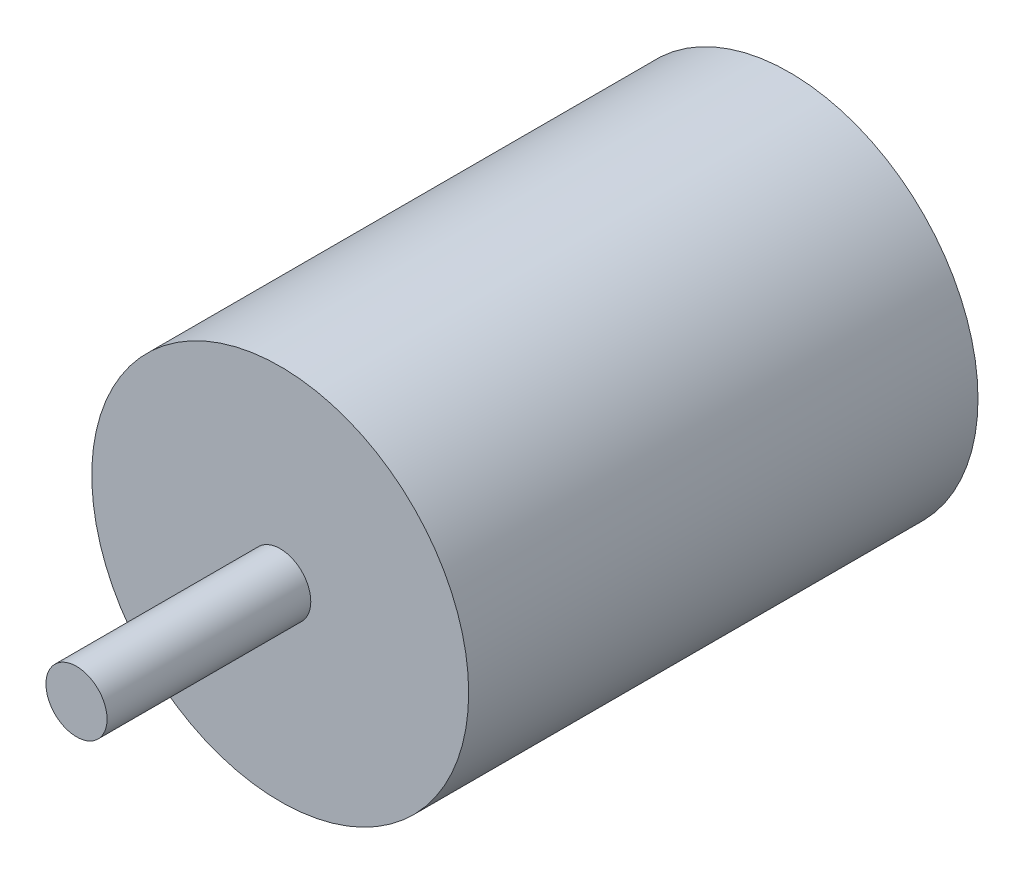
ISO-10303-21;
HEADER;
FILE_DESCRIPTION(('STEP AP214'),'2;1');
FILE_NAME('part.step','',(''),(''),'','','');
FILE_SCHEMA(('AUTOMOTIVE_DESIGN { 1 0 10303 214 1 1 1 1 }'));
ENDSEC;
DATA;
#1=APPLICATION_CONTEXT('core data for automotive mechanical design processes');
#2=APPLICATION_PROTOCOL_DEFINITION('international standard','automotive_design',2000,#1);
#3=PRODUCT_CONTEXT('',#1,'mechanical');
#4=PRODUCT('Part','Part','',(#3));
#5=PRODUCT_RELATED_PRODUCT_CATEGORY('part','',(#4));
#6=PRODUCT_DEFINITION_FORMATION('','',#4);
#7=PRODUCT_DEFINITION_CONTEXT('part definition',#1,'design');
#8=PRODUCT_DEFINITION('design','',#6,#7);
#9=PRODUCT_DEFINITION_SHAPE('','',#8);
#10=(LENGTH_UNIT() NAMED_UNIT(*) SI_UNIT(.MILLI.,.METRE.));
#11=(NAMED_UNIT(*) PLANE_ANGLE_UNIT() SI_UNIT($,.RADIAN.));
#12=(NAMED_UNIT(*) SI_UNIT($,.STERADIAN.) SOLID_ANGLE_UNIT());
#13=UNCERTAINTY_MEASURE_WITH_UNIT(LENGTH_MEASURE(1.E-05),#10,'distance_accuracy_value','');
#14=(GEOMETRIC_REPRESENTATION_CONTEXT(3) GLOBAL_UNCERTAINTY_ASSIGNED_CONTEXT((#13)) GLOBAL_UNIT_ASSIGNED_CONTEXT((#10,
#11,#12)) REPRESENTATION_CONTEXT('',''));
#15=CARTESIAN_POINT('',(0.,0.,0.));
#16=DIRECTION('',(0.,0.,1.));
#17=DIRECTION('',(1.,0.,0.));
#18=AXIS2_PLACEMENT_3D('',#15,#16,#17);
#19=CARTESIAN_POINT('',(0.,0.,50.));
#20=DIRECTION('',(0.,0.,-1.));
#21=DIRECTION('',(-1.,0.,0.));
#22=AXIS2_PLACEMENT_3D('',#19,#20,#21);
#23=CYLINDRICAL_SURFACE('',#22,18.5);
#24=CARTESIAN_POINT('',(0.,0.,50.));
#25=DIRECTION('',(0.,0.,1.));
#26=DIRECTION('',(1.,0.,0.));
#27=AXIS2_PLACEMENT_3D('',#24,#25,#26);
#28=CIRCLE('',#27,18.5);
#29=CARTESIAN_POINT('',(18.5,0.,50.));
#30=VERTEX_POINT('',#29);
#31=EDGE_CURVE('E42',#30,#30,#28,.T.);
#32=ORIENTED_EDGE('',*,*,#31,.F.);
#33=EDGE_LOOP('',(#32));
#34=FACE_BOUND('',#33,.T.);
#35=CARTESIAN_POINT('',(0.,0.,0.));
#36=DIRECTION('',(0.,0.,1.));
#37=DIRECTION('',(1.,0.,0.));
#38=AXIS2_PLACEMENT_3D('',#35,#36,#37);
#39=CIRCLE('',#38,18.5);
#40=CARTESIAN_POINT('',(18.5,0.,0.));
#41=VERTEX_POINT('',#40);
#42=EDGE_CURVE('E38',#41,#41,#39,.T.);
#43=ORIENTED_EDGE('',*,*,#42,.T.);
#44=EDGE_LOOP('',(#43));
#45=FACE_BOUND('',#44,.T.);
#46=ADVANCED_FACE('F35',(#34,#45),#23,.T.);
#47=CARTESIAN_POINT('',(0.,0.,50.));
#48=DIRECTION('',(0.,0.,1.));
#49=DIRECTION('',(1.,0.,0.));
#50=AXIS2_PLACEMENT_3D('',#47,#48,#49);
#51=PLANE('',#50);
#52=CARTESIAN_POINT('',(0.,0.,50.));
#53=DIRECTION('',(0.,0.,1.));
#54=DIRECTION('',(1.,0.,0.));
#55=AXIS2_PLACEMENT_3D('',#52,#53,#54);
#56=CIRCLE('',#55,3.);
#57=CARTESIAN_POINT('',(3.,0.,50.));
#58=VERTEX_POINT('',#57);
#59=EDGE_CURVE('E10',#58,#58,#56,.T.);
#60=ORIENTED_EDGE('',*,*,#59,.F.);
#61=EDGE_LOOP('',(#60));
#62=FACE_BOUND('',#61,.T.);
#63=ORIENTED_EDGE('',*,*,#31,.T.);
#64=EDGE_LOOP('',(#63));
#65=FACE_BOUND('',#64,.T.);
#66=ADVANCED_FACE('F59',(#62,#65),#51,.T.);
#67=CARTESIAN_POINT('',(0.,0.,0.));
#68=DIRECTION('',(0.,0.,1.));
#69=DIRECTION('',(1.,0.,0.));
#70=AXIS2_PLACEMENT_3D('',#67,#68,#69);
#71=PLANE('',#70);
#72=ORIENTED_EDGE('',*,*,#42,.F.);
#73=EDGE_LOOP('',(#72));
#74=FACE_BOUND('',#73,.T.);
#75=ADVANCED_FACE('F56',(#74),#71,.F.);
#76=CARTESIAN_POINT('',(0.,0.,70.));
#77=DIRECTION('',(0.,0.,-1.));
#78=DIRECTION('',(-1.,0.,0.));
#79=AXIS2_PLACEMENT_3D('',#76,#77,#78);
#80=CYLINDRICAL_SURFACE('',#79,3.);
#81=CARTESIAN_POINT('',(0.,0.,70.));
#82=DIRECTION('',(0.,0.,1.));
#83=DIRECTION('',(1.,0.,0.));
#84=AXIS2_PLACEMENT_3D('',#81,#82,#83);
#85=CIRCLE('',#84,3.);
#86=CARTESIAN_POINT('',(3.,0.,70.));
#87=VERTEX_POINT('',#86);
#88=EDGE_CURVE('E48',#87,#87,#85,.T.);
#89=ORIENTED_EDGE('',*,*,#88,.F.);
#90=EDGE_LOOP('',(#89));
#91=FACE_BOUND('',#90,.T.);
#92=ORIENTED_EDGE('',*,*,#59,.T.);
#93=EDGE_LOOP('',(#92));
#94=FACE_BOUND('',#93,.T.);
#95=ADVANCED_FACE('F58',(#91,#94),#80,.T.);
#96=CARTESIAN_POINT('',(0.,0.,70.));
#97=DIRECTION('',(0.,0.,1.));
#98=DIRECTION('',(1.,0.,0.));
#99=AXIS2_PLACEMENT_3D('',#96,#97,#98);
#100=PLANE('',#99);
#101=ORIENTED_EDGE('',*,*,#88,.T.);
#102=EDGE_LOOP('',(#101));
#103=FACE_BOUND('',#102,.T.);
#104=ADVANCED_FACE('F64',(#103),#100,.T.);
#105=CLOSED_SHELL('',(#46,#66,#75,#95,#104));
#106=MANIFOLD_SOLID_BREP('B2',#105);
#107=ADVANCED_BREP_SHAPE_REPRESENTATION('',(#18,#106),#14);
#108=SHAPE_DEFINITION_REPRESENTATION(#9,#107);
ENDSEC;
END-ISO-10303-21;
